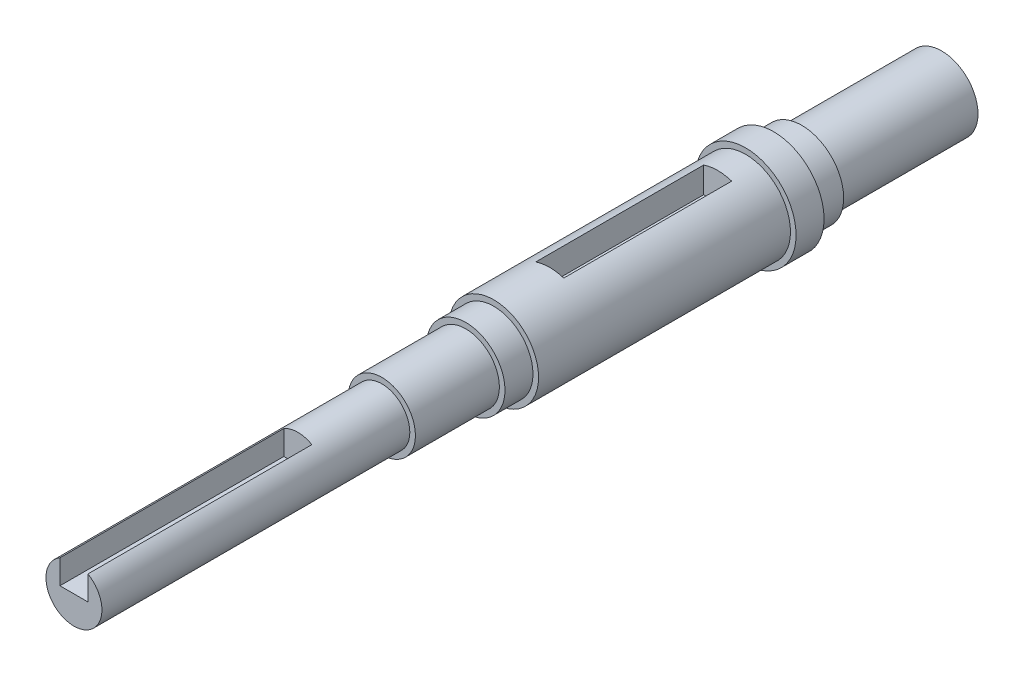
ISO-10303-21;
HEADER;
FILE_DESCRIPTION(('STEP AP214'),'2;1');
FILE_NAME('part.step','',(''),(''),'','','');
FILE_SCHEMA(('AUTOMOTIVE_DESIGN { 1 0 10303 214 1 1 1 1 }'));
ENDSEC;
DATA;
#1=APPLICATION_CONTEXT('core data for automotive mechanical design processes');
#2=APPLICATION_PROTOCOL_DEFINITION('international standard','automotive_design',2000,#1);
#3=PRODUCT_CONTEXT('',#1,'mechanical');
#4=PRODUCT('Part','Part','',(#3));
#5=PRODUCT_RELATED_PRODUCT_CATEGORY('part','',(#4));
#6=PRODUCT_DEFINITION_FORMATION('','',#4);
#7=PRODUCT_DEFINITION_CONTEXT('part definition',#1,'design');
#8=PRODUCT_DEFINITION('design','',#6,#7);
#9=PRODUCT_DEFINITION_SHAPE('','',#8);
#10=(LENGTH_UNIT() NAMED_UNIT(*) SI_UNIT(.MILLI.,.METRE.));
#11=(NAMED_UNIT(*) PLANE_ANGLE_UNIT() SI_UNIT($,.RADIAN.));
#12=(NAMED_UNIT(*) SI_UNIT($,.STERADIAN.) SOLID_ANGLE_UNIT());
#13=UNCERTAINTY_MEASURE_WITH_UNIT(LENGTH_MEASURE(1.E-05),#10,'distance_accuracy_value','');
#14=(GEOMETRIC_REPRESENTATION_CONTEXT(3) GLOBAL_UNCERTAINTY_ASSIGNED_CONTEXT((#13)) GLOBAL_UNIT_ASSIGNED_CONTEXT((#10,
#11,#12)) REPRESENTATION_CONTEXT('',''));
#15=CARTESIAN_POINT('',(0.,0.,0.));
#16=DIRECTION('',(0.,0.,1.));
#17=DIRECTION('',(1.,0.,0.));
#18=AXIS2_PLACEMENT_3D('',#15,#16,#17);
#19=CARTESIAN_POINT('',(0.,0.,0.));
#20=DIRECTION('',(0.,0.,-1.));
#21=DIRECTION('',(-1.,0.,0.));
#22=AXIS2_PLACEMENT_3D('',#19,#20,#21);
#23=PLANE('',#22);
#24=DIRECTION('',(1.,0.,0.));
#25=VECTOR('',#24,1.);
#26=CARTESIAN_POINT('',(-3.175,0.,0.));
#27=LINE('',#26,#25);
#28=CARTESIAN_POINT('',(-3.175,0.,0.));
#29=VERTEX_POINT('',#28);
#30=CARTESIAN_POINT('',(3.175,0.,0.));
#31=VERTEX_POINT('',#30);
#32=EDGE_CURVE('E148',#29,#31,#27,.T.);
#33=ORIENTED_EDGE('',*,*,#32,.F.);
#34=DIRECTION('',(0.,1.,0.));
#35=VECTOR('',#34,1.);
#36=CARTESIAN_POINT('',(-3.175,0.,0.));
#37=LINE('',#36,#35);
#38=CARTESIAN_POINT('',(-3.175,5.49926131403118,0.));
#39=VERTEX_POINT('',#38);
#40=EDGE_CURVE('E160',#29,#39,#37,.T.);
#41=ORIENTED_EDGE('',*,*,#40,.T.);
#42=CARTESIAN_POINT('',(0.,0.,0.));
#43=DIRECTION('',(0.,0.,1.));
#44=DIRECTION('',(1.,0.,0.));
#45=AXIS2_PLACEMENT_3D('',#42,#43,#44);
#46=CIRCLE('',#45,6.34999999999999);
#47=CARTESIAN_POINT('',(3.175,5.49926131403117,0.));
#48=VERTEX_POINT('',#47);
#49=EDGE_CURVE('E226',#39,#48,#46,.T.);
#50=ORIENTED_EDGE('',*,*,#49,.T.);
#51=DIRECTION('',(0.,1.,0.));
#52=VECTOR('',#51,1.);
#53=CARTESIAN_POINT('',(3.175,0.,0.));
#54=LINE('',#53,#52);
#55=EDGE_CURVE('E64',#31,#48,#54,.T.);
#56=ORIENTED_EDGE('',*,*,#55,.F.);
#57=EDGE_LOOP('',(#33,#41,#50,#56));
#58=FACE_BOUND('',#57,.T.);
#59=ADVANCED_FACE('F41',(#58),#23,.F.);
#60=CARTESIAN_POINT('',(0.,0.,0.));
#61=DIRECTION('',(0.,0.,1.));
#62=DIRECTION('',(1.,0.,0.));
#63=AXIS2_PLACEMENT_3D('',#60,#61,#62);
#64=CYLINDRICAL_SURFACE('',#63,6.34999999999999);
#65=ORIENTED_EDGE('',*,*,#49,.F.);
#66=DIRECTION('',(0.,0.,1.));
#67=VECTOR('',#66,1.);
#68=CARTESIAN_POINT('',(-3.175,5.49926131403118,0.));
#69=LINE('',#68,#67);
#70=CARTESIAN_POINT('',(-3.17500000000002,5.49926131403117,-50.8));
#71=VERTEX_POINT('',#70);
#72=EDGE_CURVE('E237',#39,#71,#69,.F.);
#73=ORIENTED_EDGE('',*,*,#72,.T.);
#74=CARTESIAN_POINT('',(0.,0.,-50.8));
#75=DIRECTION('',(0.,0.,-1.));
#76=DIRECTION('',(-1.,0.,0.));
#77=AXIS2_PLACEMENT_3D('',#74,#75,#76);
#78=CIRCLE('',#77,6.34999999999999);
#79=CARTESIAN_POINT('',(3.175,5.49926131403118,-50.8));
#80=VERTEX_POINT('',#79);
#81=EDGE_CURVE('E230',#71,#80,#78,.T.);
#82=ORIENTED_EDGE('',*,*,#81,.T.);
#83=DIRECTION('',(0.,0.,1.));
#84=VECTOR('',#83,1.);
#85=CARTESIAN_POINT('',(3.175,5.49926131403118,0.));
#86=LINE('',#85,#84);
#87=EDGE_CURVE('E234',#80,#48,#86,.T.);
#88=ORIENTED_EDGE('',*,*,#87,.T.);
#89=EDGE_LOOP('',(#65,#73,#82,#88));
#90=FACE_BOUND('',#89,.T.);
#91=CARTESIAN_POINT('',(0.,0.,-69.85));
#92=DIRECTION('',(0.,0.,1.));
#93=DIRECTION('',(1.,0.,0.));
#94=AXIS2_PLACEMENT_3D('',#91,#92,#93);
#95=CIRCLE('',#94,6.35);
#96=CARTESIAN_POINT('',(6.35,0.,-69.85));
#97=VERTEX_POINT('',#96);
#98=EDGE_CURVE('E222',#97,#97,#95,.T.);
#99=ORIENTED_EDGE('',*,*,#98,.T.);
#100=EDGE_LOOP('',(#99));
#101=FACE_BOUND('',#100,.T.);
#102=ADVANCED_FACE('F266',(#90,#101),#64,.T.);
#103=CARTESIAN_POINT('',(0.,6.35,-69.85));
#104=DIRECTION('',(0.,0.,-1.));
#105=DIRECTION('',(-1.,0.,0.));
#106=AXIS2_PLACEMENT_3D('',#103,#104,#105);
#107=PLANE('',#106);
#108=ORIENTED_EDGE('',*,*,#98,.F.);
#109=EDGE_LOOP('',(#108));
#110=FACE_BOUND('',#109,.T.);
#111=CARTESIAN_POINT('',(0.,0.,-69.85));
#112=DIRECTION('',(0.,0.,1.));
#113=DIRECTION('',(1.,0.,0.));
#114=AXIS2_PLACEMENT_3D('',#111,#112,#113);
#115=CIRCLE('',#114,7.61999999999999);
#116=CARTESIAN_POINT('',(7.61999999999999,0.,-69.85));
#117=VERTEX_POINT('',#116);
#118=EDGE_CURVE('E218',#117,#117,#115,.T.);
#119=ORIENTED_EDGE('',*,*,#118,.T.);
#120=EDGE_LOOP('',(#119));
#121=FACE_BOUND('',#120,.T.);
#122=ADVANCED_FACE('F271',(#110,#121),#107,.F.);
#123=CARTESIAN_POINT('',(0.,0.,0.));
#124=DIRECTION('',(0.,0.,1.));
#125=DIRECTION('',(1.,0.,0.));
#126=AXIS2_PLACEMENT_3D('',#123,#124,#125);
#127=CYLINDRICAL_SURFACE('',#126,7.61999999999999);
#128=ORIENTED_EDGE('',*,*,#118,.F.);
#129=EDGE_LOOP('',(#128));
#130=FACE_BOUND('',#129,.T.);
#131=CARTESIAN_POINT('',(0.,0.,-88.9000000000001));
#132=DIRECTION('',(0.,0.,1.));
#133=DIRECTION('',(1.,0.,0.));
#134=AXIS2_PLACEMENT_3D('',#131,#132,#133);
#135=CIRCLE('',#134,7.61999999999999);
#136=CARTESIAN_POINT('',(7.61999999999999,0.,-88.9000000000001));
#137=VERTEX_POINT('',#136);
#138=EDGE_CURVE('E214',#137,#137,#135,.T.);
#139=ORIENTED_EDGE('',*,*,#138,.T.);
#140=EDGE_LOOP('',(#139));
#141=FACE_BOUND('',#140,.T.);
#142=ADVANCED_FACE('F335',(#130,#141),#127,.T.);
#143=CARTESIAN_POINT('',(0.,7.61999999999999,-88.9000000000001));
#144=DIRECTION('',(0.,0.,-1.));
#145=DIRECTION('',(-1.,0.,0.));
#146=AXIS2_PLACEMENT_3D('',#143,#144,#145);
#147=PLANE('',#146);
#148=ORIENTED_EDGE('',*,*,#138,.F.);
#149=EDGE_LOOP('',(#148));
#150=FACE_BOUND('',#149,.T.);
#151=CARTESIAN_POINT('',(0.,0.,-88.9000000000001));
#152=DIRECTION('',(0.,0.,1.));
#153=DIRECTION('',(1.,0.,0.));
#154=AXIS2_PLACEMENT_3D('',#151,#152,#153);
#155=CIRCLE('',#154,8.89);
#156=CARTESIAN_POINT('',(8.89,0.,-88.9000000000001));
#157=VERTEX_POINT('',#156);
#158=EDGE_CURVE('E210',#157,#157,#155,.T.);
#159=ORIENTED_EDGE('',*,*,#158,.T.);
#160=EDGE_LOOP('',(#159));
#161=FACE_BOUND('',#160,.T.);
#162=ADVANCED_FACE('F331',(#150,#161),#147,.F.);
#163=CARTESIAN_POINT('',(0.,0.,0.));
#164=DIRECTION('',(0.,0.,1.));
#165=DIRECTION('',(1.,0.,0.));
#166=AXIS2_PLACEMENT_3D('',#163,#164,#165);
#167=CYLINDRICAL_SURFACE('',#166,8.89);
#168=ORIENTED_EDGE('',*,*,#158,.F.);
#169=EDGE_LOOP('',(#168));
#170=FACE_BOUND('',#169,.T.);
#171=CARTESIAN_POINT('',(0.,0.,-95.2500000000001));
#172=DIRECTION('',(0.,0.,1.));
#173=DIRECTION('',(1.,0.,0.));
#174=AXIS2_PLACEMENT_3D('',#171,#172,#173);
#175=CIRCLE('',#174,8.89);
#176=CARTESIAN_POINT('',(8.89,0.,-95.2500000000001));
#177=VERTEX_POINT('',#176);
#178=EDGE_CURVE('E206',#177,#177,#175,.T.);
#179=ORIENTED_EDGE('',*,*,#178,.T.);
#180=EDGE_LOOP('',(#179));
#181=FACE_BOUND('',#180,.T.);
#182=ADVANCED_FACE('F327',(#170,#181),#167,.T.);
#183=CARTESIAN_POINT('',(0.,8.89,-95.2500000000001));
#184=DIRECTION('',(0.,0.,-1.));
#185=DIRECTION('',(-1.,0.,0.));
#186=AXIS2_PLACEMENT_3D('',#183,#184,#185);
#187=PLANE('',#186);
#188=ORIENTED_EDGE('',*,*,#178,.F.);
#189=EDGE_LOOP('',(#188));
#190=FACE_BOUND('',#189,.T.);
#191=CARTESIAN_POINT('',(0.,0.,-95.2500000000001));
#192=DIRECTION('',(0.,0.,1.));
#193=DIRECTION('',(1.,0.,0.));
#194=AXIS2_PLACEMENT_3D('',#191,#192,#193);
#195=CIRCLE('',#194,10.16);
#196=CARTESIAN_POINT('',(10.16,0.,-95.2500000000001));
#197=VERTEX_POINT('',#196);
#198=EDGE_CURVE('E202',#197,#197,#195,.T.);
#199=ORIENTED_EDGE('',*,*,#198,.T.);
#200=EDGE_LOOP('',(#199));
#201=FACE_BOUND('',#200,.T.);
#202=ADVANCED_FACE('F324',(#190,#201),#187,.F.);
#203=CARTESIAN_POINT('',(0.,0.,0.));
#204=DIRECTION('',(0.,0.,1.));
#205=DIRECTION('',(1.,0.,0.));
#206=AXIS2_PLACEMENT_3D('',#203,#204,#205);
#207=CYLINDRICAL_SURFACE('',#206,10.16);
#208=DIRECTION('',(0.,0.,1.));
#209=VECTOR('',#208,1.);
#210=CARTESIAN_POINT('',(3.175,9.65116443751737,0.));
#211=LINE('',#210,#209);
#212=CARTESIAN_POINT('',(3.175,9.65116443751737,-146.05));
#213=VERTEX_POINT('',#212);
#214=CARTESIAN_POINT('',(3.175,9.65116443751737,-107.95));
#215=VERTEX_POINT('',#214);
#216=EDGE_CURVE('E11',#213,#215,#211,.T.);
#217=ORIENTED_EDGE('',*,*,#216,.T.);
#218=CARTESIAN_POINT('',(0.,0.,-107.95));
#219=DIRECTION('',(0.,0.,1.));
#220=DIRECTION('',(1.,0.,0.));
#221=AXIS2_PLACEMENT_3D('',#218,#219,#220);
#222=CIRCLE('',#221,10.16);
#223=CARTESIAN_POINT('',(-3.175,9.65116443751737,-107.95));
#224=VERTEX_POINT('',#223);
#225=EDGE_CURVE('E241',#215,#224,#222,.T.);
#226=ORIENTED_EDGE('',*,*,#225,.T.);
#227=DIRECTION('',(0.,0.,1.));
#228=VECTOR('',#227,1.);
#229=CARTESIAN_POINT('',(-3.175,9.65116443751737,0.));
#230=LINE('',#229,#228);
#231=CARTESIAN_POINT('',(-3.175,9.65116443751737,-146.05));
#232=VERTEX_POINT('',#231);
#233=EDGE_CURVE('E49',#224,#232,#230,.F.);
#234=ORIENTED_EDGE('',*,*,#233,.T.);
#235=CARTESIAN_POINT('',(0.,0.,-146.05));
#236=DIRECTION('',(0.,0.,-1.));
#237=DIRECTION('',(-1.,0.,0.));
#238=AXIS2_PLACEMENT_3D('',#235,#236,#237);
#239=CIRCLE('',#238,10.16);
#240=EDGE_CURVE('E244',#232,#213,#239,.T.);
#241=ORIENTED_EDGE('',*,*,#240,.T.);
#242=EDGE_LOOP('',(#217,#226,#234,#241));
#243=FACE_BOUND('',#242,.T.);
#244=ORIENTED_EDGE('',*,*,#198,.F.);
#245=EDGE_LOOP('',(#244));
#246=FACE_BOUND('',#245,.T.);
#247=CARTESIAN_POINT('',(0.,0.,-152.4));
#248=DIRECTION('',(0.,0.,1.));
#249=DIRECTION('',(1.,0.,0.));
#250=AXIS2_PLACEMENT_3D('',#247,#248,#249);
#251=CIRCLE('',#250,10.16);
#252=CARTESIAN_POINT('',(10.16,0.,-152.4));
#253=VERTEX_POINT('',#252);
#254=EDGE_CURVE('E198',#253,#253,#251,.T.);
#255=ORIENTED_EDGE('',*,*,#254,.T.);
#256=EDGE_LOOP('',(#255));
#257=FACE_BOUND('',#256,.T.);
#258=ADVANCED_FACE('F249',(#243,#246,#257),#207,.T.);
#259=CARTESIAN_POINT('',(0.,10.16,-152.4));
#260=DIRECTION('',(0.,0.,-1.));
#261=DIRECTION('',(-1.,0.,0.));
#262=AXIS2_PLACEMENT_3D('',#259,#260,#261);
#263=PLANE('',#262);
#264=ORIENTED_EDGE('',*,*,#254,.F.);
#265=EDGE_LOOP('',(#264));
#266=FACE_BOUND('',#265,.T.);
#267=CARTESIAN_POINT('',(0.,0.,-152.4));
#268=DIRECTION('',(0.,0.,1.));
#269=DIRECTION('',(1.,0.,0.));
#270=AXIS2_PLACEMENT_3D('',#267,#268,#269);
#271=CIRCLE('',#270,11.43);
#272=CARTESIAN_POINT('',(11.43,0.,-152.4));
#273=VERTEX_POINT('',#272);
#274=EDGE_CURVE('E194',#273,#273,#271,.T.);
#275=ORIENTED_EDGE('',*,*,#274,.T.);
#276=EDGE_LOOP('',(#275));
#277=FACE_BOUND('',#276,.T.);
#278=ADVANCED_FACE('F317',(#266,#277),#263,.F.);
#279=CARTESIAN_POINT('',(0.,0.,0.));
#280=DIRECTION('',(0.,0.,1.));
#281=DIRECTION('',(1.,0.,0.));
#282=AXIS2_PLACEMENT_3D('',#279,#280,#281);
#283=CYLINDRICAL_SURFACE('',#282,11.43);
#284=ORIENTED_EDGE('',*,*,#274,.F.);
#285=EDGE_LOOP('',(#284));
#286=FACE_BOUND('',#285,.T.);
#287=CARTESIAN_POINT('',(0.,0.,-158.75));
#288=DIRECTION('',(0.,0.,1.));
#289=DIRECTION('',(1.,0.,0.));
#290=AXIS2_PLACEMENT_3D('',#287,#288,#289);
#291=CIRCLE('',#290,11.43);
#292=CARTESIAN_POINT('',(11.43,0.,-158.75));
#293=VERTEX_POINT('',#292);
#294=EDGE_CURVE('E190',#293,#293,#291,.T.);
#295=ORIENTED_EDGE('',*,*,#294,.T.);
#296=EDGE_LOOP('',(#295));
#297=FACE_BOUND('',#296,.T.);
#298=ADVANCED_FACE('F313',(#286,#297),#283,.T.);
#299=CARTESIAN_POINT('',(0.,11.43,-158.75));
#300=DIRECTION('',(0.,0.,1.));
#301=DIRECTION('',(1.,0.,0.));
#302=AXIS2_PLACEMENT_3D('',#299,#300,#301);
#303=PLANE('',#302);
#304=ORIENTED_EDGE('',*,*,#294,.F.);
#305=EDGE_LOOP('',(#304));
#306=FACE_BOUND('',#305,.T.);
#307=CARTESIAN_POINT('',(0.,0.,-158.75));
#308=DIRECTION('',(0.,0.,1.));
#309=DIRECTION('',(1.,0.,0.));
#310=AXIS2_PLACEMENT_3D('',#307,#308,#309);
#311=CIRCLE('',#310,9.525);
#312=CARTESIAN_POINT('',(9.525,0.,-158.75));
#313=VERTEX_POINT('',#312);
#314=EDGE_CURVE('E186',#313,#313,#311,.T.);
#315=ORIENTED_EDGE('',*,*,#314,.T.);
#316=EDGE_LOOP('',(#315));
#317=FACE_BOUND('',#316,.T.);
#318=ADVANCED_FACE('F309',(#306,#317),#303,.F.);
#319=CARTESIAN_POINT('',(0.,0.,0.));
#320=DIRECTION('',(0.,0.,1.));
#321=DIRECTION('',(1.,0.,0.));
#322=AXIS2_PLACEMENT_3D('',#319,#320,#321);
#323=CYLINDRICAL_SURFACE('',#322,9.525);
#324=ORIENTED_EDGE('',*,*,#314,.F.);
#325=EDGE_LOOP('',(#324));
#326=FACE_BOUND('',#325,.T.);
#327=CARTESIAN_POINT('',(0.,0.,-165.1));
#328=DIRECTION('',(0.,0.,1.));
#329=DIRECTION('',(1.,0.,0.));
#330=AXIS2_PLACEMENT_3D('',#327,#328,#329);
#331=CIRCLE('',#330,9.525);
#332=CARTESIAN_POINT('',(9.525,0.,-165.1));
#333=VERTEX_POINT('',#332);
#334=EDGE_CURVE('E182',#333,#333,#331,.T.);
#335=ORIENTED_EDGE('',*,*,#334,.T.);
#336=EDGE_LOOP('',(#335));
#337=FACE_BOUND('',#336,.T.);
#338=ADVANCED_FACE('F305',(#326,#337),#323,.T.);
#339=CARTESIAN_POINT('',(0.,9.525,-165.1));
#340=DIRECTION('',(0.,0.,1.));
#341=DIRECTION('',(1.,0.,0.));
#342=AXIS2_PLACEMENT_3D('',#339,#340,#341);
#343=PLANE('',#342);
#344=ORIENTED_EDGE('',*,*,#334,.F.);
#345=EDGE_LOOP('',(#344));
#346=FACE_BOUND('',#345,.T.);
#347=CARTESIAN_POINT('',(0.,0.,-165.1));
#348=DIRECTION('',(0.,0.,1.));
#349=DIRECTION('',(1.,0.,0.));
#350=AXIS2_PLACEMENT_3D('',#347,#348,#349);
#351=CIRCLE('',#350,8.255);
#352=CARTESIAN_POINT('',(8.255,0.,-165.1));
#353=VERTEX_POINT('',#352);
#354=EDGE_CURVE('E178',#353,#353,#351,.T.);
#355=ORIENTED_EDGE('',*,*,#354,.T.);
#356=EDGE_LOOP('',(#355));
#357=FACE_BOUND('',#356,.T.);
#358=ADVANCED_FACE('F301',(#346,#357),#343,.F.);
#359=CARTESIAN_POINT('',(0.,0.,0.));
#360=DIRECTION('',(0.,0.,1.));
#361=DIRECTION('',(1.,0.,0.));
#362=AXIS2_PLACEMENT_3D('',#359,#360,#361);
#363=CYLINDRICAL_SURFACE('',#362,8.255);
#364=ORIENTED_EDGE('',*,*,#354,.F.);
#365=EDGE_LOOP('',(#364));
#366=FACE_BOUND('',#365,.T.);
#367=CARTESIAN_POINT('',(0.,0.,-196.85));
#368=DIRECTION('',(0.,0.,1.));
#369=DIRECTION('',(1.,0.,0.));
#370=AXIS2_PLACEMENT_3D('',#367,#368,#369);
#371=CIRCLE('',#370,8.255);
#372=CARTESIAN_POINT('',(8.255,0.,-196.85));
#373=VERTEX_POINT('',#372);
#374=EDGE_CURVE('E165',#373,#373,#371,.T.);
#375=ORIENTED_EDGE('',*,*,#374,.T.);
#376=EDGE_LOOP('',(#375));
#377=FACE_BOUND('',#376,.T.);
#378=ADVANCED_FACE('F297',(#366,#377),#363,.T.);
#379=CARTESIAN_POINT('',(0.,8.255,-196.85));
#380=DIRECTION('',(0.,0.,1.));
#381=DIRECTION('',(1.,0.,0.));
#382=AXIS2_PLACEMENT_3D('',#379,#380,#381);
#383=PLANE('',#382);
#384=ORIENTED_EDGE('',*,*,#374,.F.);
#385=EDGE_LOOP('',(#384));
#386=FACE_BOUND('',#385,.T.);
#387=ADVANCED_FACE('F291',(#386),#383,.F.);
#388=CARTESIAN_POINT('',(-3.175,0.,0.));
#389=DIRECTION('',(-1.,0.,0.));
#390=DIRECTION('',(0.,0.,1.));
#391=AXIS2_PLACEMENT_3D('',#388,#389,#390);
#392=PLANE('',#391);
#393=ORIENTED_EDGE('',*,*,#40,.F.);
#394=DIRECTION('',(0.,0.,1.));
#395=VECTOR('',#394,1.);
#396=CARTESIAN_POINT('',(-3.175,0.,0.));
#397=LINE('',#396,#395);
#398=CARTESIAN_POINT('',(-3.17500000000002,0.,-50.8));
#399=VERTEX_POINT('',#398);
#400=EDGE_CURVE('E138',#399,#29,#397,.T.);
#401=ORIENTED_EDGE('',*,*,#400,.F.);
#402=DIRECTION('',(0.,1.,0.));
#403=VECTOR('',#402,1.);
#404=CARTESIAN_POINT('',(-3.17500000000002,0.,-50.8));
#405=LINE('',#404,#403);
#406=EDGE_CURVE('E161',#399,#71,#405,.T.);
#407=ORIENTED_EDGE('',*,*,#406,.T.);
#408=ORIENTED_EDGE('',*,*,#72,.F.);
#409=EDGE_LOOP('',(#393,#401,#407,#408));
#410=FACE_BOUND('',#409,.T.);
#411=ADVANCED_FACE('F279',(#410),#392,.F.);
#412=CARTESIAN_POINT('',(-3.17500000000002,0.,-50.8));
#413=DIRECTION('',(0.,0.,-1.));
#414=DIRECTION('',(-1.,0.,0.));
#415=AXIS2_PLACEMENT_3D('',#412,#413,#414);
#416=PLANE('',#415);
#417=ORIENTED_EDGE('',*,*,#406,.F.);
#418=DIRECTION('',(-1.,0.,0.));
#419=VECTOR('',#418,1.);
#420=CARTESIAN_POINT('',(-3.17500000000002,0.,-50.8));
#421=LINE('',#420,#419);
#422=CARTESIAN_POINT('',(3.175,0.,-50.8));
#423=VERTEX_POINT('',#422);
#424=EDGE_CURVE('E156',#423,#399,#421,.T.);
#425=ORIENTED_EDGE('',*,*,#424,.F.);
#426=DIRECTION('',(0.,1.,0.));
#427=VECTOR('',#426,1.);
#428=CARTESIAN_POINT('',(3.175,0.,-50.8));
#429=LINE('',#428,#427);
#430=EDGE_CURVE('E166',#423,#80,#429,.T.);
#431=ORIENTED_EDGE('',*,*,#430,.T.);
#432=ORIENTED_EDGE('',*,*,#81,.F.);
#433=EDGE_LOOP('',(#417,#425,#431,#432));
#434=FACE_BOUND('',#433,.T.);
#435=ADVANCED_FACE('F283',(#434),#416,.F.);
#436=CARTESIAN_POINT('',(3.175,0.,0.));
#437=DIRECTION('',(1.,0.,0.));
#438=DIRECTION('',(0.,0.,-1.));
#439=AXIS2_PLACEMENT_3D('',#436,#437,#438);
#440=PLANE('',#439);
#441=ORIENTED_EDGE('',*,*,#430,.F.);
#442=DIRECTION('',(0.,0.,-1.));
#443=VECTOR('',#442,1.);
#444=CARTESIAN_POINT('',(3.175,0.,0.));
#445=LINE('',#444,#443);
#446=EDGE_CURVE('E152',#31,#423,#445,.T.);
#447=ORIENTED_EDGE('',*,*,#446,.F.);
#448=ORIENTED_EDGE('',*,*,#55,.T.);
#449=ORIENTED_EDGE('',*,*,#87,.F.);
#450=EDGE_LOOP('',(#441,#447,#448,#449));
#451=FACE_BOUND('',#450,.T.);
#452=ADVANCED_FACE('F281',(#451),#440,.F.);
#453=CARTESIAN_POINT('',(0.,0.,0.));
#454=DIRECTION('',(0.,-1.,0.));
#455=DIRECTION('',(0.,0.,-1.));
#456=AXIS2_PLACEMENT_3D('',#453,#454,#455);
#457=PLANE('',#456);
#458=ORIENTED_EDGE('',*,*,#400,.T.);
#459=ORIENTED_EDGE('',*,*,#32,.T.);
#460=ORIENTED_EDGE('',*,*,#446,.T.);
#461=ORIENTED_EDGE('',*,*,#424,.T.);
#462=EDGE_LOOP('',(#458,#459,#460,#461));
#463=FACE_BOUND('',#462,.T.);
#464=ADVANCED_FACE('F262',(#463),#457,.F.);
#465=CARTESIAN_POINT('',(-3.175,3.81,-107.95));
#466=DIRECTION('',(-1.,0.,0.));
#467=DIRECTION('',(0.,0.,1.));
#468=AXIS2_PLACEMENT_3D('',#465,#466,#467);
#469=PLANE('',#468);
#470=DIRECTION('',(0.,1.,0.));
#471=VECTOR('',#470,1.);
#472=CARTESIAN_POINT('',(-3.175,3.81,-107.95));
#473=LINE('',#472,#471);
#474=CARTESIAN_POINT('',(-3.175,3.81,-107.95));
#475=VERTEX_POINT('',#474);
#476=EDGE_CURVE('E56',#475,#224,#473,.T.);
#477=ORIENTED_EDGE('',*,*,#476,.F.);
#478=DIRECTION('',(0.,0.,1.));
#479=VECTOR('',#478,1.);
#480=CARTESIAN_POINT('',(-3.175,3.81,-107.95));
#481=LINE('',#480,#479);
#482=CARTESIAN_POINT('',(-3.175,3.81,-146.05));
#483=VERTEX_POINT('',#482);
#484=EDGE_CURVE('E108',#483,#475,#481,.T.);
#485=ORIENTED_EDGE('',*,*,#484,.F.);
#486=DIRECTION('',(0.,1.,0.));
#487=VECTOR('',#486,1.);
#488=CARTESIAN_POINT('',(-3.175,3.81,-146.05));
#489=LINE('',#488,#487);
#490=EDGE_CURVE('E135',#483,#232,#489,.T.);
#491=ORIENTED_EDGE('',*,*,#490,.T.);
#492=ORIENTED_EDGE('',*,*,#233,.F.);
#493=EDGE_LOOP('',(#477,#485,#491,#492));
#494=FACE_BOUND('',#493,.T.);
#495=ADVANCED_FACE('F105',(#494),#469,.F.);
#496=CARTESIAN_POINT('',(-3.175,3.81,-146.05));
#497=DIRECTION('',(0.,0.,-1.));
#498=DIRECTION('',(-1.,0.,0.));
#499=AXIS2_PLACEMENT_3D('',#496,#497,#498);
#500=PLANE('',#499);
#501=ORIENTED_EDGE('',*,*,#490,.F.);
#502=DIRECTION('',(-1.,0.,0.));
#503=VECTOR('',#502,1.);
#504=CARTESIAN_POINT('',(-3.175,3.81,-146.05));
#505=LINE('',#504,#503);
#506=CARTESIAN_POINT('',(3.175,3.81,-146.05));
#507=VERTEX_POINT('',#506);
#508=EDGE_CURVE('E114',#507,#483,#505,.T.);
#509=ORIENTED_EDGE('',*,*,#508,.F.);
#510=DIRECTION('',(0.,1.,0.));
#511=VECTOR('',#510,1.);
#512=CARTESIAN_POINT('',(3.175,3.81,-146.05));
#513=LINE('',#512,#511);
#514=EDGE_CURVE('E139',#507,#213,#513,.T.);
#515=ORIENTED_EDGE('',*,*,#514,.T.);
#516=ORIENTED_EDGE('',*,*,#240,.F.);
#517=EDGE_LOOP('',(#501,#509,#515,#516));
#518=FACE_BOUND('',#517,.T.);
#519=ADVANCED_FACE('F254',(#518),#500,.F.);
#520=CARTESIAN_POINT('',(3.175,3.81,-107.95));
#521=DIRECTION('',(1.,0.,0.));
#522=DIRECTION('',(0.,0.,-1.));
#523=AXIS2_PLACEMENT_3D('',#520,#521,#522);
#524=PLANE('',#523);
#525=ORIENTED_EDGE('',*,*,#514,.F.);
#526=DIRECTION('',(0.,0.,-1.));
#527=VECTOR('',#526,1.);
#528=CARTESIAN_POINT('',(3.175,3.81,-107.95));
#529=LINE('',#528,#527);
#530=CARTESIAN_POINT('',(3.175,3.81,-107.95));
#531=VERTEX_POINT('',#530);
#532=EDGE_CURVE('E124',#531,#507,#529,.T.);
#533=ORIENTED_EDGE('',*,*,#532,.F.);
#534=DIRECTION('',(0.,1.,0.));
#535=VECTOR('',#534,1.);
#536=CARTESIAN_POINT('',(3.175,3.81,-107.95));
#537=LINE('',#536,#535);
#538=EDGE_CURVE('E113',#531,#215,#537,.T.);
#539=ORIENTED_EDGE('',*,*,#538,.T.);
#540=ORIENTED_EDGE('',*,*,#216,.F.);
#541=EDGE_LOOP('',(#525,#533,#539,#540));
#542=FACE_BOUND('',#541,.T.);
#543=ADVANCED_FACE('F252',(#542),#524,.F.);
#544=CARTESIAN_POINT('',(-3.175,3.81,-107.95));
#545=DIRECTION('',(0.,0.,1.));
#546=DIRECTION('',(1.,0.,0.));
#547=AXIS2_PLACEMENT_3D('',#544,#545,#546);
#548=PLANE('',#547);
#549=ORIENTED_EDGE('',*,*,#538,.F.);
#550=DIRECTION('',(1.,0.,0.));
#551=VECTOR('',#550,1.);
#552=CARTESIAN_POINT('',(-3.175,3.81,-107.95));
#553=LINE('',#552,#551);
#554=EDGE_CURVE('E117',#475,#531,#553,.T.);
#555=ORIENTED_EDGE('',*,*,#554,.F.);
#556=ORIENTED_EDGE('',*,*,#476,.T.);
#557=ORIENTED_EDGE('',*,*,#225,.F.);
#558=EDGE_LOOP('',(#549,#555,#556,#557));
#559=FACE_BOUND('',#558,.T.);
#560=ADVANCED_FACE('F118',(#559),#548,.F.);
#561=CARTESIAN_POINT('',(0.,3.81,0.));
#562=DIRECTION('',(0.,-1.,0.));
#563=DIRECTION('',(0.,0.,-1.));
#564=AXIS2_PLACEMENT_3D('',#561,#562,#563);
#565=PLANE('',#564);
#566=ORIENTED_EDGE('',*,*,#484,.T.);
#567=ORIENTED_EDGE('',*,*,#554,.T.);
#568=ORIENTED_EDGE('',*,*,#532,.T.);
#569=ORIENTED_EDGE('',*,*,#508,.T.);
#570=EDGE_LOOP('',(#566,#567,#568,#569));
#571=FACE_BOUND('',#570,.T.);
#572=ADVANCED_FACE('F126',(#571),#565,.F.);
#573=CLOSED_SHELL('',(#59,#102,#122,#142,#162,#182,#202,#258,#278,#298,#318,#338,#358,#378,#387,
#411,#435,#452,#464,#495,#519,#543,#560,#572));
#574=MANIFOLD_SOLID_BREP('B2',#573);
#575=ADVANCED_BREP_SHAPE_REPRESENTATION('',(#18,#574),#14);
#576=SHAPE_DEFINITION_REPRESENTATION(#9,#575);
ENDSEC;
END-ISO-10303-21;
